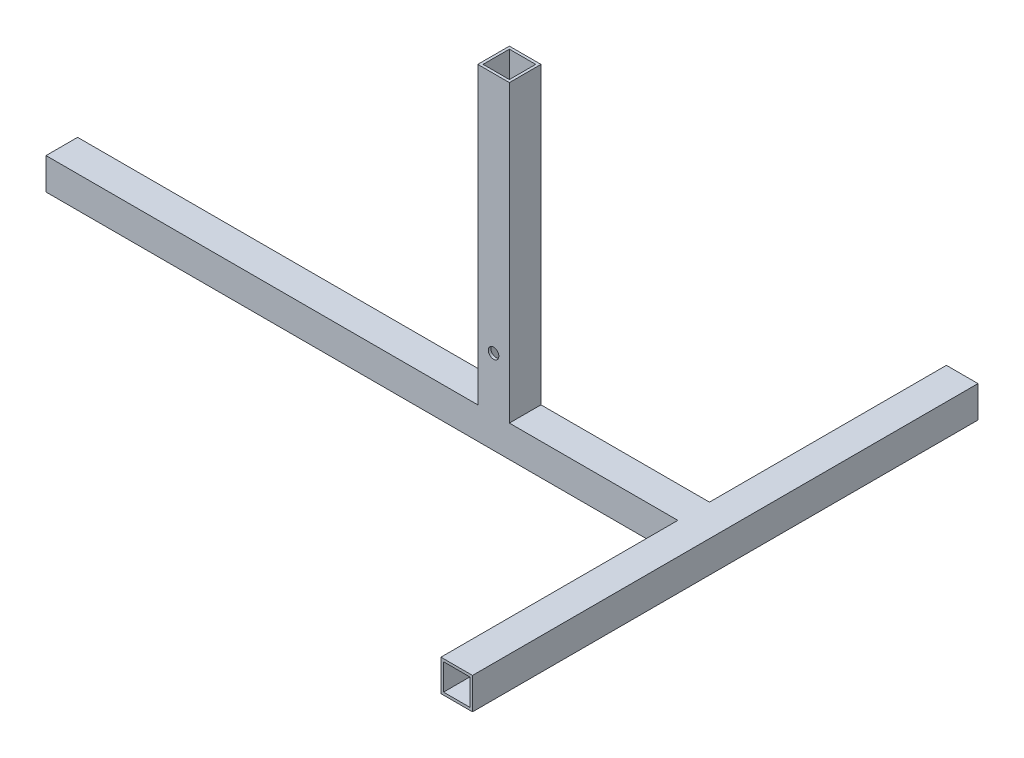
ISO-10303-21;
HEADER;
FILE_DESCRIPTION(('STEP AP214'),'2;1');
FILE_NAME('part.step','',(''),(''),'','','');
FILE_SCHEMA(('AUTOMOTIVE_DESIGN { 1 0 10303 214 1 1 1 1 }'));
ENDSEC;
DATA;
#1=APPLICATION_CONTEXT('core data for automotive mechanical design processes');
#2=APPLICATION_PROTOCOL_DEFINITION('international standard','automotive_design',2000,#1);
#3=PRODUCT_CONTEXT('',#1,'mechanical');
#4=PRODUCT('Part','Part','',(#3));
#5=PRODUCT_RELATED_PRODUCT_CATEGORY('part','',(#4));
#6=PRODUCT_DEFINITION_FORMATION('','',#4);
#7=PRODUCT_DEFINITION_CONTEXT('part definition',#1,'design');
#8=PRODUCT_DEFINITION('design','',#6,#7);
#9=PRODUCT_DEFINITION_SHAPE('','',#8);
#10=(LENGTH_UNIT() NAMED_UNIT(*) SI_UNIT(.MILLI.,.METRE.));
#11=(NAMED_UNIT(*) PLANE_ANGLE_UNIT() SI_UNIT($,.RADIAN.));
#12=(NAMED_UNIT(*) SI_UNIT($,.STERADIAN.) SOLID_ANGLE_UNIT());
#13=UNCERTAINTY_MEASURE_WITH_UNIT(LENGTH_MEASURE(1.E-05),#10,'distance_accuracy_value','');
#14=(GEOMETRIC_REPRESENTATION_CONTEXT(3) GLOBAL_UNCERTAINTY_ASSIGNED_CONTEXT((#13)) GLOBAL_UNIT_ASSIGNED_CONTEXT((#10,
#11,#12)) REPRESENTATION_CONTEXT('',''));
#15=CARTESIAN_POINT('',(0.,0.,0.));
#16=DIRECTION('',(0.,0.,1.));
#17=DIRECTION('',(1.,0.,0.));
#18=AXIS2_PLACEMENT_3D('',#15,#16,#17);
#19=CARTESIAN_POINT('',(-539.75,38.1,19.05));
#20=DIRECTION('',(0.,1.,0.));
#21=DIRECTION('',(0.,0.,1.));
#22=AXIS2_PLACEMENT_3D('',#19,#20,#21);
#23=PLANE('',#22);
#24=DIRECTION('',(0.,0.,-1.));
#25=VECTOR('',#24,1.);
#26=CARTESIAN_POINT('',(19.05,38.1,-19.05));
#27=LINE('',#26,#25);
#28=CARTESIAN_POINT('',(19.05,38.1,19.05));
#29=VERTEX_POINT('',#28);
#30=CARTESIAN_POINT('',(19.05,38.1,-19.05));
#31=VERTEX_POINT('',#30);
#32=EDGE_CURVE('E312',#29,#31,#27,.T.);
#33=ORIENTED_EDGE('',*,*,#32,.F.);
#34=DIRECTION('',(1.,0.,0.));
#35=VECTOR('',#34,1.);
#36=CARTESIAN_POINT('',(-539.75,38.1,19.05));
#37=LINE('',#36,#35);
#38=CARTESIAN_POINT('',(222.25,38.1,19.05));
#39=VERTEX_POINT('',#38);
#40=EDGE_CURVE('E52',#29,#39,#37,.T.);
#41=ORIENTED_EDGE('',*,*,#40,.T.);
#42=DIRECTION('',(0.,0.,-1.));
#43=VECTOR('',#42,1.);
#44=CARTESIAN_POINT('',(222.25,38.1,304.8));
#45=LINE('',#44,#43);
#46=CARTESIAN_POINT('',(222.25,38.1,304.8));
#47=VERTEX_POINT('',#46);
#48=EDGE_CURVE('E270',#47,#39,#45,.T.);
#49=ORIENTED_EDGE('',*,*,#48,.F.);
#50=DIRECTION('',(-1.,0.,0.));
#51=VECTOR('',#50,1.);
#52=CARTESIAN_POINT('',(222.25,38.1,304.8));
#53=LINE('',#52,#51);
#54=CARTESIAN_POINT('',(260.35,38.1,304.8));
#55=VERTEX_POINT('',#54);
#56=EDGE_CURVE('E259',#55,#47,#53,.T.);
#57=ORIENTED_EDGE('',*,*,#56,.F.);
#58=DIRECTION('',(0.,0.,-1.));
#59=VECTOR('',#58,1.);
#60=CARTESIAN_POINT('',(260.35,38.1,304.8));
#61=LINE('',#60,#59);
#62=CARTESIAN_POINT('',(260.35,38.1,-304.8));
#63=VERTEX_POINT('',#62);
#64=EDGE_CURVE('E273',#55,#63,#61,.T.);
#65=ORIENTED_EDGE('',*,*,#64,.T.);
#66=DIRECTION('',(-1.,0.,0.));
#67=VECTOR('',#66,1.);
#68=CARTESIAN_POINT('',(222.25,38.1,-304.8));
#69=LINE('',#68,#67);
#70=CARTESIAN_POINT('',(222.25,38.1,-304.8));
#71=VERTEX_POINT('',#70);
#72=EDGE_CURVE('E255',#63,#71,#69,.T.);
#73=ORIENTED_EDGE('',*,*,#72,.T.);
#74=CARTESIAN_POINT('',(222.25,38.1,-19.0499999999999));
#75=VERTEX_POINT('',#74);
#76=EDGE_CURVE('E261',#75,#71,#45,.T.);
#77=ORIENTED_EDGE('',*,*,#76,.F.);
#78=DIRECTION('',(1.,0.,0.));
#79=VECTOR('',#78,1.);
#80=CARTESIAN_POINT('',(-539.75,38.1,-19.05));
#81=LINE('',#80,#79);
#82=EDGE_CURVE('E68',#31,#75,#81,.T.);
#83=ORIENTED_EDGE('',*,*,#82,.F.);
#84=EDGE_LOOP('',(#33,#41,#49,#57,#65,#73,#77,#83));
#85=FACE_BOUND('',#84,.T.);
#86=ADVANCED_FACE('F43',(#85),#23,.T.);
#87=CARTESIAN_POINT('',(-539.75,0.,19.05));
#88=DIRECTION('',(0.,0.,1.));
#89=DIRECTION('',(1.,0.,0.));
#90=AXIS2_PLACEMENT_3D('',#87,#88,#89);
#91=PLANE('',#90);
#92=CARTESIAN_POINT('',(0.,101.6,19.05));
#93=DIRECTION('',(0.,0.,1.));
#94=DIRECTION('',(1.,0.,0.));
#95=AXIS2_PLACEMENT_3D('',#92,#93,#94);
#96=CIRCLE('',#95,6.35);
#97=CARTESIAN_POINT('',(6.35,101.6,19.05));
#98=VERTEX_POINT('',#97);
#99=EDGE_CURVE('E489',#98,#98,#96,.T.);
#100=ORIENTED_EDGE('',*,*,#99,.F.);
#101=EDGE_LOOP('',(#100));
#102=FACE_BOUND('',#101,.T.);
#103=DIRECTION('',(1.,0.,0.));
#104=VECTOR('',#103,1.);
#105=CARTESIAN_POINT('',(-539.75,0.,19.05));
#106=LINE('',#105,#104);
#107=CARTESIAN_POINT('',(-539.75,0.,19.05));
#108=VERTEX_POINT('',#107);
#109=CARTESIAN_POINT('',(222.25,0.,19.05));
#110=VERTEX_POINT('',#109);
#111=EDGE_CURVE('E394',#108,#110,#106,.T.);
#112=ORIENTED_EDGE('',*,*,#111,.T.);
#113=DIRECTION('',(0.,-1.,0.));
#114=VECTOR('',#113,1.);
#115=CARTESIAN_POINT('',(222.25,0.,19.05));
#116=LINE('',#115,#114);
#117=EDGE_CURVE('E352',#39,#110,#116,.T.);
#118=ORIENTED_EDGE('',*,*,#117,.F.);
#119=ORIENTED_EDGE('',*,*,#40,.F.);
#120=DIRECTION('',(0.,-1.,0.));
#121=VECTOR('',#120,1.);
#122=CARTESIAN_POINT('',(19.05,393.7,19.0500000000001));
#123=LINE('',#122,#121);
#124=CARTESIAN_POINT('',(19.05,393.7,19.0500000000001));
#125=VERTEX_POINT('',#124);
#126=EDGE_CURVE('E323',#125,#29,#123,.T.);
#127=ORIENTED_EDGE('',*,*,#126,.F.);
#128=DIRECTION('',(1.,0.,0.));
#129=VECTOR('',#128,1.);
#130=CARTESIAN_POINT('',(-19.05,393.7,19.0500000000001));
#131=LINE('',#130,#129);
#132=CARTESIAN_POINT('',(-19.05,393.7,19.0500000000001));
#133=VERTEX_POINT('',#132);
#134=EDGE_CURVE('E321',#133,#125,#131,.T.);
#135=ORIENTED_EDGE('',*,*,#134,.F.);
#136=DIRECTION('',(0.,-1.,0.));
#137=VECTOR('',#136,1.);
#138=CARTESIAN_POINT('',(-19.05,393.7,19.0500000000001));
#139=LINE('',#138,#137);
#140=CARTESIAN_POINT('',(-19.05,38.1,19.05));
#141=VERTEX_POINT('',#140);
#142=EDGE_CURVE('E332',#133,#141,#139,.T.);
#143=ORIENTED_EDGE('',*,*,#142,.T.);
#144=CARTESIAN_POINT('',(-539.75,38.1,19.05));
#145=VERTEX_POINT('',#144);
#146=EDGE_CURVE('E12',#145,#141,#37,.T.);
#147=ORIENTED_EDGE('',*,*,#146,.F.);
#148=DIRECTION('',(0.,-1.,0.));
#149=VECTOR('',#148,1.);
#150=CARTESIAN_POINT('',(-539.75,0.,19.05));
#151=LINE('',#150,#149);
#152=EDGE_CURVE('E374',#145,#108,#151,.T.);
#153=ORIENTED_EDGE('',*,*,#152,.T.);
#154=EDGE_LOOP('',(#112,#118,#119,#127,#135,#143,#147,#153));
#155=FACE_BOUND('',#154,.T.);
#156=ADVANCED_FACE('F45',(#102,#155),#91,.T.);
#157=DIRECTION('',(0.,0.,1.));
#158=VECTOR('',#157,1.);
#159=CARTESIAN_POINT('',(-19.05,38.1,-19.05));
#160=LINE('',#159,#158);
#161=CARTESIAN_POINT('',(-19.05,38.1,-19.05));
#162=VERTEX_POINT('',#161);
#163=EDGE_CURVE('E317',#162,#141,#160,.T.);
#164=ORIENTED_EDGE('',*,*,#163,.F.);
#165=CARTESIAN_POINT('',(-539.75,38.1,-19.05));
#166=VERTEX_POINT('',#165);
#167=EDGE_CURVE('E396',#166,#162,#81,.T.);
#168=ORIENTED_EDGE('',*,*,#167,.F.);
#169=DIRECTION('',(0.,0.,1.));
#170=VECTOR('',#169,1.);
#171=CARTESIAN_POINT('',(-539.75,38.1,19.05));
#172=LINE('',#171,#170);
#173=EDGE_CURVE('E392',#166,#145,#172,.T.);
#174=ORIENTED_EDGE('',*,*,#173,.T.);
#175=ORIENTED_EDGE('',*,*,#146,.T.);
#176=EDGE_LOOP('',(#164,#168,#174,#175));
#177=FACE_BOUND('',#176,.T.);
#178=ADVANCED_FACE('F432',(#177),#23,.T.);
#179=CARTESIAN_POINT('',(-539.75,0.,-19.05));
#180=DIRECTION('',(0.,0.,-1.));
#181=DIRECTION('',(-1.,0.,0.));
#182=AXIS2_PLACEMENT_3D('',#179,#180,#181);
#183=PLANE('',#182);
#184=CARTESIAN_POINT('',(0.,101.6,-19.05));
#185=DIRECTION('',(0.,0.,-1.));
#186=DIRECTION('',(-1.,0.,0.));
#187=AXIS2_PLACEMENT_3D('',#184,#185,#186);
#188=CIRCLE('',#187,6.35);
#189=CARTESIAN_POINT('',(-6.35,101.6,-19.05));
#190=VERTEX_POINT('',#189);
#191=EDGE_CURVE('E240',#190,#190,#188,.T.);
#192=ORIENTED_EDGE('',*,*,#191,.F.);
#193=EDGE_LOOP('',(#192));
#194=FACE_BOUND('',#193,.T.);
#195=ORIENTED_EDGE('',*,*,#167,.T.);
#196=DIRECTION('',(0.,-1.,0.));
#197=VECTOR('',#196,1.);
#198=CARTESIAN_POINT('',(-19.05,393.7,-19.0499999999999));
#199=LINE('',#198,#197);
#200=CARTESIAN_POINT('',(-19.05,393.7,-19.0499999999999));
#201=VERTEX_POINT('',#200);
#202=EDGE_CURVE('E335',#201,#162,#199,.T.);
#203=ORIENTED_EDGE('',*,*,#202,.F.);
#204=DIRECTION('',(-1.,0.,0.));
#205=VECTOR('',#204,1.);
#206=CARTESIAN_POINT('',(-19.05,393.7,-19.0499999999999));
#207=LINE('',#206,#205);
#208=CARTESIAN_POINT('',(19.05,393.7,-19.0499999999999));
#209=VERTEX_POINT('',#208);
#210=EDGE_CURVE('E316',#209,#201,#207,.T.);
#211=ORIENTED_EDGE('',*,*,#210,.F.);
#212=DIRECTION('',(0.,-1.,0.));
#213=VECTOR('',#212,1.);
#214=CARTESIAN_POINT('',(19.05,393.7,-19.0499999999999));
#215=LINE('',#214,#213);
#216=EDGE_CURVE('E338',#209,#31,#215,.T.);
#217=ORIENTED_EDGE('',*,*,#216,.T.);
#218=ORIENTED_EDGE('',*,*,#82,.T.);
#219=DIRECTION('',(0.,1.,0.));
#220=VECTOR('',#219,1.);
#221=CARTESIAN_POINT('',(222.25,0.,-19.05));
#222=LINE('',#221,#220);
#223=CARTESIAN_POINT('',(222.25,0.,-19.05));
#224=VERTEX_POINT('',#223);
#225=EDGE_CURVE('E355',#224,#75,#222,.T.);
#226=ORIENTED_EDGE('',*,*,#225,.F.);
#227=DIRECTION('',(1.,0.,0.));
#228=VECTOR('',#227,1.);
#229=CARTESIAN_POINT('',(-539.75,0.,-19.05));
#230=LINE('',#229,#228);
#231=CARTESIAN_POINT('',(-539.75,0.,-19.05));
#232=VERTEX_POINT('',#231);
#233=EDGE_CURVE('E399',#232,#224,#230,.T.);
#234=ORIENTED_EDGE('',*,*,#233,.F.);
#235=DIRECTION('',(0.,1.,0.));
#236=VECTOR('',#235,1.);
#237=CARTESIAN_POINT('',(-539.75,0.,-19.05));
#238=LINE('',#237,#236);
#239=EDGE_CURVE('E389',#232,#166,#238,.T.);
#240=ORIENTED_EDGE('',*,*,#239,.T.);
#241=EDGE_LOOP('',(#195,#203,#211,#217,#218,#226,#234,#240));
#242=FACE_BOUND('',#241,.T.);
#243=ADVANCED_FACE('F434',(#194,#242),#183,.T.);
#244=CARTESIAN_POINT('',(-539.75,0.,19.05));
#245=DIRECTION('',(0.,-1.,0.));
#246=DIRECTION('',(0.,0.,-1.));
#247=AXIS2_PLACEMENT_3D('',#244,#245,#246);
#248=PLANE('',#247);
#249=ORIENTED_EDGE('',*,*,#233,.T.);
#250=DIRECTION('',(0.,0.,-1.));
#251=VECTOR('',#250,1.);
#252=CARTESIAN_POINT('',(222.25,0.,304.8));
#253=LINE('',#252,#251);
#254=CARTESIAN_POINT('',(222.25,0.,-304.8));
#255=VERTEX_POINT('',#254);
#256=EDGE_CURVE('E279',#224,#255,#253,.T.);
#257=ORIENTED_EDGE('',*,*,#256,.T.);
#258=DIRECTION('',(1.,0.,0.));
#259=VECTOR('',#258,1.);
#260=CARTESIAN_POINT('',(222.25,0.,-304.8));
#261=LINE('',#260,#259);
#262=CARTESIAN_POINT('',(260.35,0.,-304.8));
#263=VERTEX_POINT('',#262);
#264=EDGE_CURVE('E264',#255,#263,#261,.T.);
#265=ORIENTED_EDGE('',*,*,#264,.T.);
#266=DIRECTION('',(0.,0.,-1.));
#267=VECTOR('',#266,1.);
#268=CARTESIAN_POINT('',(260.35,0.,304.8));
#269=LINE('',#268,#267);
#270=CARTESIAN_POINT('',(260.35,0.,304.8));
#271=VERTEX_POINT('',#270);
#272=EDGE_CURVE('E276',#271,#263,#269,.T.);
#273=ORIENTED_EDGE('',*,*,#272,.F.);
#274=DIRECTION('',(1.,0.,0.));
#275=VECTOR('',#274,1.);
#276=CARTESIAN_POINT('',(222.25,0.,304.8));
#277=LINE('',#276,#275);
#278=CARTESIAN_POINT('',(222.25,0.,304.8));
#279=VERTEX_POINT('',#278);
#280=EDGE_CURVE('E254',#279,#271,#277,.T.);
#281=ORIENTED_EDGE('',*,*,#280,.F.);
#282=EDGE_CURVE('E280',#279,#110,#253,.T.);
#283=ORIENTED_EDGE('',*,*,#282,.T.);
#284=ORIENTED_EDGE('',*,*,#111,.F.);
#285=DIRECTION('',(0.,0.,-1.));
#286=VECTOR('',#285,1.);
#287=CARTESIAN_POINT('',(-539.75,0.,19.05));
#288=LINE('',#287,#286);
#289=EDGE_CURVE('E386',#108,#232,#288,.T.);
#290=ORIENTED_EDGE('',*,*,#289,.T.);
#291=EDGE_LOOP('',(#249,#257,#265,#273,#281,#283,#284,#290));
#292=FACE_BOUND('',#291,.T.);
#293=ADVANCED_FACE('F411',(#292),#248,.T.);
#294=CARTESIAN_POINT('',(-539.75,0.,0.));
#295=DIRECTION('',(-1.,0.,0.));
#296=DIRECTION('',(0.,0.,1.));
#297=AXIS2_PLACEMENT_3D('',#294,#295,#296);
#298=PLANE('',#297);
#299=DIRECTION('',(0.,-1.,0.));
#300=VECTOR('',#299,1.);
#301=CARTESIAN_POINT('',(-539.75,3.175,15.875));
#302=LINE('',#301,#300);
#303=CARTESIAN_POINT('',(-539.75,34.925,15.875));
#304=VERTEX_POINT('',#303);
#305=CARTESIAN_POINT('',(-539.75,3.175,15.875));
#306=VERTEX_POINT('',#305);
#307=EDGE_CURVE('E358',#304,#306,#302,.T.);
#308=ORIENTED_EDGE('',*,*,#307,.T.);
#309=DIRECTION('',(0.,0.,-1.));
#310=VECTOR('',#309,1.);
#311=CARTESIAN_POINT('',(-539.75,3.175,15.875));
#312=LINE('',#311,#310);
#313=CARTESIAN_POINT('',(-539.75,3.175,-15.875));
#314=VERTEX_POINT('',#313);
#315=EDGE_CURVE('E361',#306,#314,#312,.T.);
#316=ORIENTED_EDGE('',*,*,#315,.T.);
#317=DIRECTION('',(0.,1.,0.));
#318=VECTOR('',#317,1.);
#319=CARTESIAN_POINT('',(-539.75,3.175,-15.875));
#320=LINE('',#319,#318);
#321=CARTESIAN_POINT('',(-539.75,34.925,-15.875));
#322=VERTEX_POINT('',#321);
#323=EDGE_CURVE('E364',#314,#322,#320,.T.);
#324=ORIENTED_EDGE('',*,*,#323,.T.);
#325=DIRECTION('',(0.,0.,1.));
#326=VECTOR('',#325,1.);
#327=CARTESIAN_POINT('',(-539.75,34.925,15.875));
#328=LINE('',#327,#326);
#329=EDGE_CURVE('E367',#322,#304,#328,.T.);
#330=ORIENTED_EDGE('',*,*,#329,.T.);
#331=EDGE_LOOP('',(#308,#316,#324,#330));
#332=FACE_BOUND('',#331,.T.);
#333=ORIENTED_EDGE('',*,*,#152,.F.);
#334=ORIENTED_EDGE('',*,*,#173,.F.);
#335=ORIENTED_EDGE('',*,*,#239,.F.);
#336=ORIENTED_EDGE('',*,*,#289,.F.);
#337=EDGE_LOOP('',(#333,#334,#335,#336));
#338=FACE_BOUND('',#337,.T.);
#339=ADVANCED_FACE('F439',(#332,#338),#298,.T.);
#340=CARTESIAN_POINT('',(-539.75,3.175,15.875));
#341=DIRECTION('',(0.,0.,1.));
#342=DIRECTION('',(1.,0.,0.));
#343=AXIS2_PLACEMENT_3D('',#340,#341,#342);
#344=PLANE('',#343);
#345=DIRECTION('',(1.,0.,0.));
#346=VECTOR('',#345,1.);
#347=CARTESIAN_POINT('',(-539.75,34.925,15.875));
#348=LINE('',#347,#346);
#349=CARTESIAN_POINT('',(222.25,34.925,15.875));
#350=VERTEX_POINT('',#349);
#351=EDGE_CURVE('E371',#304,#350,#348,.T.);
#352=ORIENTED_EDGE('',*,*,#351,.T.);
#353=DIRECTION('',(0.,-1.,0.));
#354=VECTOR('',#353,1.);
#355=CARTESIAN_POINT('',(222.25,3.175,15.875));
#356=LINE('',#355,#354);
#357=CARTESIAN_POINT('',(222.25,3.175,15.875));
#358=VERTEX_POINT('',#357);
#359=EDGE_CURVE('E340',#350,#358,#356,.T.);
#360=ORIENTED_EDGE('',*,*,#359,.T.);
#361=DIRECTION('',(1.,0.,0.));
#362=VECTOR('',#361,1.);
#363=CARTESIAN_POINT('',(-539.75,3.175,15.875));
#364=LINE('',#363,#362);
#365=EDGE_CURVE('E370',#306,#358,#364,.T.);
#366=ORIENTED_EDGE('',*,*,#365,.F.);
#367=ORIENTED_EDGE('',*,*,#307,.F.);
#368=EDGE_LOOP('',(#352,#360,#366,#367));
#369=FACE_BOUND('',#368,.T.);
#370=ADVANCED_FACE('F534',(#369),#344,.F.);
#371=CARTESIAN_POINT('',(-539.75,34.925,15.875));
#372=DIRECTION('',(0.,1.,0.));
#373=DIRECTION('',(0.,0.,1.));
#374=AXIS2_PLACEMENT_3D('',#371,#372,#373);
#375=PLANE('',#374);
#376=DIRECTION('',(1.,0.,0.));
#377=VECTOR('',#376,1.);
#378=CARTESIAN_POINT('',(-539.75,34.925,-15.875));
#379=LINE('',#378,#377);
#380=CARTESIAN_POINT('',(222.25,34.925,-15.875));
#381=VERTEX_POINT('',#380);
#382=EDGE_CURVE('E375',#322,#381,#379,.T.);
#383=ORIENTED_EDGE('',*,*,#382,.T.);
#384=DIRECTION('',(0.,0.,1.));
#385=VECTOR('',#384,1.);
#386=CARTESIAN_POINT('',(222.25,34.925,15.875));
#387=LINE('',#386,#385);
#388=EDGE_CURVE('E349',#381,#350,#387,.T.);
#389=ORIENTED_EDGE('',*,*,#388,.T.);
#390=ORIENTED_EDGE('',*,*,#351,.F.);
#391=ORIENTED_EDGE('',*,*,#329,.F.);
#392=EDGE_LOOP('',(#383,#389,#390,#391));
#393=FACE_BOUND('',#392,.T.);
#394=ADVANCED_FACE('F530',(#393),#375,.F.);
#395=CARTESIAN_POINT('',(-539.75,3.175,-15.875));
#396=DIRECTION('',(0.,0.,-1.));
#397=DIRECTION('',(-1.,0.,0.));
#398=AXIS2_PLACEMENT_3D('',#395,#396,#397);
#399=PLANE('',#398);
#400=DIRECTION('',(1.,0.,0.));
#401=VECTOR('',#400,1.);
#402=CARTESIAN_POINT('',(-539.75,3.175,-15.875));
#403=LINE('',#402,#401);
#404=CARTESIAN_POINT('',(222.25,3.175,-15.875));
#405=VERTEX_POINT('',#404);
#406=EDGE_CURVE('E378',#314,#405,#403,.T.);
#407=ORIENTED_EDGE('',*,*,#406,.T.);
#408=DIRECTION('',(0.,1.,0.));
#409=VECTOR('',#408,1.);
#410=CARTESIAN_POINT('',(222.25,3.175,-15.875));
#411=LINE('',#410,#409);
#412=EDGE_CURVE('E346',#405,#381,#411,.T.);
#413=ORIENTED_EDGE('',*,*,#412,.T.);
#414=ORIENTED_EDGE('',*,*,#382,.F.);
#415=ORIENTED_EDGE('',*,*,#323,.F.);
#416=EDGE_LOOP('',(#407,#413,#414,#415));
#417=FACE_BOUND('',#416,.T.);
#418=ADVANCED_FACE('F533',(#417),#399,.F.);
#419=CARTESIAN_POINT('',(-539.75,3.175,15.875));
#420=DIRECTION('',(0.,-1.,0.));
#421=DIRECTION('',(0.,0.,-1.));
#422=AXIS2_PLACEMENT_3D('',#419,#420,#421);
#423=PLANE('',#422);
#424=ORIENTED_EDGE('',*,*,#365,.T.);
#425=DIRECTION('',(0.,0.,-1.));
#426=VECTOR('',#425,1.);
#427=CARTESIAN_POINT('',(222.25,3.175,15.875));
#428=LINE('',#427,#426);
#429=EDGE_CURVE('E343',#358,#405,#428,.T.);
#430=ORIENTED_EDGE('',*,*,#429,.T.);
#431=ORIENTED_EDGE('',*,*,#406,.F.);
#432=ORIENTED_EDGE('',*,*,#315,.F.);
#433=EDGE_LOOP('',(#424,#430,#431,#432));
#434=FACE_BOUND('',#433,.T.);
#435=ADVANCED_FACE('F525',(#434),#423,.F.);
#436=CARTESIAN_POINT('',(0.,393.7,0.));
#437=DIRECTION('',(0.,1.,0.));
#438=DIRECTION('',(0.,0.,1.));
#439=AXIS2_PLACEMENT_3D('',#436,#437,#438);
#440=PLANE('',#439);
#441=DIRECTION('',(0.,0.,-1.));
#442=VECTOR('',#441,1.);
#443=CARTESIAN_POINT('',(19.05,393.7,-19.0499999999999));
#444=LINE('',#443,#442);
#445=EDGE_CURVE('E313',#125,#209,#444,.T.);
#446=ORIENTED_EDGE('',*,*,#445,.T.);
#447=ORIENTED_EDGE('',*,*,#210,.T.);
#448=DIRECTION('',(0.,0.,1.));
#449=VECTOR('',#448,1.);
#450=CARTESIAN_POINT('',(-19.05,393.7,-19.0499999999999));
#451=LINE('',#450,#449);
#452=EDGE_CURVE('E319',#201,#133,#451,.T.);
#453=ORIENTED_EDGE('',*,*,#452,.T.);
#454=ORIENTED_EDGE('',*,*,#134,.T.);
#455=EDGE_LOOP('',(#446,#447,#453,#454));
#456=FACE_BOUND('',#455,.T.);
#457=DIRECTION('',(0.,0.,1.));
#458=VECTOR('',#457,1.);
#459=CARTESIAN_POINT('',(-15.875,393.7,-15.8749999999999));
#460=LINE('',#459,#458);
#461=CARTESIAN_POINT('',(-15.875,393.7,-15.8749999999999));
#462=VERTEX_POINT('',#461);
#463=CARTESIAN_POINT('',(-15.875,393.7,15.8750000000001));
#464=VERTEX_POINT('',#463);
#465=EDGE_CURVE('E286',#462,#464,#460,.T.);
#466=ORIENTED_EDGE('',*,*,#465,.F.);
#467=DIRECTION('',(-1.,0.,0.));
#468=VECTOR('',#467,1.);
#469=CARTESIAN_POINT('',(-15.875,393.7,-15.8749999999999));
#470=LINE('',#469,#468);
#471=CARTESIAN_POINT('',(15.875,393.7,-15.8749999999999));
#472=VERTEX_POINT('',#471);
#473=EDGE_CURVE('E284',#472,#462,#470,.T.);
#474=ORIENTED_EDGE('',*,*,#473,.F.);
#475=DIRECTION('',(0.,0.,-1.));
#476=VECTOR('',#475,1.);
#477=CARTESIAN_POINT('',(15.875,393.7,-15.8749999999999));
#478=LINE('',#477,#476);
#479=CARTESIAN_POINT('',(15.875,393.7,15.8750000000001));
#480=VERTEX_POINT('',#479);
#481=EDGE_CURVE('E292',#480,#472,#478,.T.);
#482=ORIENTED_EDGE('',*,*,#481,.F.);
#483=DIRECTION('',(1.,0.,0.));
#484=VECTOR('',#483,1.);
#485=CARTESIAN_POINT('',(-15.875,393.7,15.8750000000001));
#486=LINE('',#485,#484);
#487=EDGE_CURVE('E289',#464,#480,#486,.T.);
#488=ORIENTED_EDGE('',*,*,#487,.F.);
#489=EDGE_LOOP('',(#466,#474,#482,#488));
#490=FACE_BOUND('',#489,.T.);
#491=ADVANCED_FACE('F424',(#456,#490),#440,.T.);
#492=CARTESIAN_POINT('',(19.05,393.7,-19.0499999999999));
#493=DIRECTION('',(-1.,0.,0.));
#494=DIRECTION('',(0.,0.,1.));
#495=AXIS2_PLACEMENT_3D('',#492,#493,#494);
#496=PLANE('',#495);
#497=ORIENTED_EDGE('',*,*,#32,.T.);
#498=ORIENTED_EDGE('',*,*,#216,.F.);
#499=ORIENTED_EDGE('',*,*,#445,.F.);
#500=ORIENTED_EDGE('',*,*,#126,.T.);
#501=EDGE_LOOP('',(#497,#498,#499,#500));
#502=FACE_BOUND('',#501,.T.);
#503=ADVANCED_FACE('F421',(#502),#496,.F.);
#504=CARTESIAN_POINT('',(-19.05,393.7,-19.0499999999999));
#505=DIRECTION('',(1.,0.,0.));
#506=DIRECTION('',(0.,0.,-1.));
#507=AXIS2_PLACEMENT_3D('',#504,#505,#506);
#508=PLANE('',#507);
#509=ORIENTED_EDGE('',*,*,#163,.T.);
#510=ORIENTED_EDGE('',*,*,#142,.F.);
#511=ORIENTED_EDGE('',*,*,#452,.F.);
#512=ORIENTED_EDGE('',*,*,#202,.T.);
#513=EDGE_LOOP('',(#509,#510,#511,#512));
#514=FACE_BOUND('',#513,.T.);
#515=ADVANCED_FACE('F430',(#514),#508,.F.);
#516=CARTESIAN_POINT('',(-15.875,393.7,-15.8749999999999));
#517=DIRECTION('',(0.,0.,1.));
#518=DIRECTION('',(0.,-1.,0.));
#519=AXIS2_PLACEMENT_3D('',#516,#517,#518);
#520=PLANE('',#519);
#521=CARTESIAN_POINT('',(0.,101.6,-15.875));
#522=DIRECTION('',(0.,0.,1.));
#523=DIRECTION('',(0.,-1.,0.));
#524=AXIS2_PLACEMENT_3D('',#521,#522,#523);
#525=CIRCLE('',#524,6.35);
#526=CARTESIAN_POINT('',(0.,95.25,-15.875));
#527=VERTEX_POINT('',#526);
#528=EDGE_CURVE('E485',#527,#527,#525,.T.);
#529=ORIENTED_EDGE('',*,*,#528,.F.);
#530=EDGE_LOOP('',(#529));
#531=FACE_BOUND('',#530,.T.);
#532=DIRECTION('',(-1.,0.,0.));
#533=VECTOR('',#532,1.);
#534=CARTESIAN_POINT('',(-15.875,38.1,-15.875));
#535=LINE('',#534,#533);
#536=CARTESIAN_POINT('',(15.875,38.1,-15.875));
#537=VERTEX_POINT('',#536);
#538=CARTESIAN_POINT('',(-15.875,38.1,-15.875));
#539=VERTEX_POINT('',#538);
#540=EDGE_CURVE('E283',#537,#539,#535,.T.);
#541=ORIENTED_EDGE('',*,*,#540,.F.);
#542=DIRECTION('',(0.,-1.,0.));
#543=VECTOR('',#542,1.);
#544=CARTESIAN_POINT('',(15.875,393.7,-15.8749999999999));
#545=LINE('',#544,#543);
#546=EDGE_CURVE('E60',#472,#537,#545,.T.);
#547=ORIENTED_EDGE('',*,*,#546,.F.);
#548=ORIENTED_EDGE('',*,*,#473,.T.);
#549=DIRECTION('',(0.,-1.,0.));
#550=VECTOR('',#549,1.);
#551=CARTESIAN_POINT('',(-15.875,393.7,-15.8749999999999));
#552=LINE('',#551,#550);
#553=EDGE_CURVE('E309',#462,#539,#552,.T.);
#554=ORIENTED_EDGE('',*,*,#553,.T.);
#555=EDGE_LOOP('',(#541,#547,#548,#554));
#556=FACE_BOUND('',#555,.T.);
#557=ADVANCED_FACE('F510',(#531,#556),#520,.T.);
#558=CARTESIAN_POINT('',(-15.875,393.7,-15.8749999999999));
#559=DIRECTION('',(1.,0.,0.));
#560=DIRECTION('',(0.,0.,-1.));
#561=AXIS2_PLACEMENT_3D('',#558,#559,#560);
#562=PLANE('',#561);
#563=DIRECTION('',(0.,0.,1.));
#564=VECTOR('',#563,1.);
#565=CARTESIAN_POINT('',(-15.875,38.1,-15.875));
#566=LINE('',#565,#564);
#567=CARTESIAN_POINT('',(-15.875,38.1,15.875));
#568=VERTEX_POINT('',#567);
#569=EDGE_CURVE('E296',#539,#568,#566,.T.);
#570=ORIENTED_EDGE('',*,*,#569,.F.);
#571=ORIENTED_EDGE('',*,*,#553,.F.);
#572=ORIENTED_EDGE('',*,*,#465,.T.);
#573=DIRECTION('',(0.,-1.,0.));
#574=VECTOR('',#573,1.);
#575=CARTESIAN_POINT('',(-15.875,393.7,15.8750000000001));
#576=LINE('',#575,#574);
#577=EDGE_CURVE('E307',#464,#568,#576,.T.);
#578=ORIENTED_EDGE('',*,*,#577,.T.);
#579=EDGE_LOOP('',(#570,#571,#572,#578));
#580=FACE_BOUND('',#579,.T.);
#581=ADVANCED_FACE('F501',(#580),#562,.T.);
#582=CARTESIAN_POINT('',(-15.875,393.7,15.8750000000001));
#583=DIRECTION('',(0.,0.,-1.));
#584=DIRECTION('',(0.,1.,0.));
#585=AXIS2_PLACEMENT_3D('',#582,#583,#584);
#586=PLANE('',#585);
#587=CARTESIAN_POINT('',(0.,101.6,15.875));
#588=DIRECTION('',(0.,0.,-1.));
#589=DIRECTION('',(0.,1.,0.));
#590=AXIS2_PLACEMENT_3D('',#587,#588,#589);
#591=CIRCLE('',#590,6.35);
#592=CARTESIAN_POINT('',(0.,107.95,15.875));
#593=VERTEX_POINT('',#592);
#594=EDGE_CURVE('E47',#593,#593,#591,.T.);
#595=ORIENTED_EDGE('',*,*,#594,.F.);
#596=EDGE_LOOP('',(#595));
#597=FACE_BOUND('',#596,.T.);
#598=DIRECTION('',(1.,0.,0.));
#599=VECTOR('',#598,1.);
#600=CARTESIAN_POINT('',(-15.875,38.1,15.875));
#601=LINE('',#600,#599);
#602=CARTESIAN_POINT('',(15.875,38.1,15.875));
#603=VERTEX_POINT('',#602);
#604=EDGE_CURVE('E299',#568,#603,#601,.T.);
#605=ORIENTED_EDGE('',*,*,#604,.F.);
#606=ORIENTED_EDGE('',*,*,#577,.F.);
#607=ORIENTED_EDGE('',*,*,#487,.T.);
#608=DIRECTION('',(0.,-1.,0.));
#609=VECTOR('',#608,1.);
#610=CARTESIAN_POINT('',(15.875,393.7,15.8750000000001));
#611=LINE('',#610,#609);
#612=EDGE_CURVE('E305',#480,#603,#611,.T.);
#613=ORIENTED_EDGE('',*,*,#612,.T.);
#614=EDGE_LOOP('',(#605,#606,#607,#613));
#615=FACE_BOUND('',#614,.T.);
#616=ADVANCED_FACE('F498',(#597,#615),#586,.T.);
#617=CARTESIAN_POINT('',(15.875,393.7,-15.8749999999999));
#618=DIRECTION('',(-1.,0.,0.));
#619=DIRECTION('',(0.,0.,1.));
#620=AXIS2_PLACEMENT_3D('',#617,#618,#619);
#621=PLANE('',#620);
#622=DIRECTION('',(0.,0.,-1.));
#623=VECTOR('',#622,1.);
#624=CARTESIAN_POINT('',(15.875,38.1,-15.875));
#625=LINE('',#624,#623);
#626=EDGE_CURVE('E287',#603,#537,#625,.T.);
#627=ORIENTED_EDGE('',*,*,#626,.F.);
#628=ORIENTED_EDGE('',*,*,#612,.F.);
#629=ORIENTED_EDGE('',*,*,#481,.T.);
#630=ORIENTED_EDGE('',*,*,#546,.T.);
#631=EDGE_LOOP('',(#627,#628,#629,#630));
#632=FACE_BOUND('',#631,.T.);
#633=ADVANCED_FACE('F472',(#632),#621,.T.);
#634=ORIENTED_EDGE('',*,*,#626,.T.);
#635=ORIENTED_EDGE('',*,*,#540,.T.);
#636=ORIENTED_EDGE('',*,*,#569,.T.);
#637=ORIENTED_EDGE('',*,*,#604,.T.);
#638=EDGE_LOOP('',(#634,#635,#636,#637));
#639=FACE_BOUND('',#638,.T.);
#640=ADVANCED_FACE('F463',(#639),#23,.T.);
#641=CARTESIAN_POINT('',(222.25,0.,304.8));
#642=DIRECTION('',(1.,0.,0.));
#643=DIRECTION('',(0.,0.,-1.));
#644=AXIS2_PLACEMENT_3D('',#641,#642,#643);
#645=PLANE('',#644);
#646=ORIENTED_EDGE('',*,*,#359,.F.);
#647=ORIENTED_EDGE('',*,*,#388,.F.);
#648=ORIENTED_EDGE('',*,*,#412,.F.);
#649=ORIENTED_EDGE('',*,*,#429,.F.);
#650=EDGE_LOOP('',(#646,#647,#648,#649));
#651=FACE_BOUND('',#650,.T.);
#652=ADVANCED_FACE('F471',(#651),#645,.F.);
#653=ORIENTED_EDGE('',*,*,#48,.T.);
#654=ORIENTED_EDGE('',*,*,#117,.T.);
#655=ORIENTED_EDGE('',*,*,#282,.F.);
#656=DIRECTION('',(0.,-1.,0.));
#657=VECTOR('',#656,1.);
#658=CARTESIAN_POINT('',(222.25,0.,304.8));
#659=LINE('',#658,#657);
#660=EDGE_CURVE('E251',#47,#279,#659,.T.);
#661=ORIENTED_EDGE('',*,*,#660,.F.);
#662=EDGE_LOOP('',(#653,#654,#655,#661));
#663=FACE_BOUND('',#662,.T.);
#664=ADVANCED_FACE('F408',(#663),#645,.F.);
#665=ORIENTED_EDGE('',*,*,#256,.F.);
#666=ORIENTED_EDGE('',*,*,#225,.T.);
#667=ORIENTED_EDGE('',*,*,#76,.T.);
#668=DIRECTION('',(0.,-1.,0.));
#669=VECTOR('',#668,1.);
#670=CARTESIAN_POINT('',(222.25,0.,-304.8));
#671=LINE('',#670,#669);
#672=EDGE_CURVE('E225',#71,#255,#671,.T.);
#673=ORIENTED_EDGE('',*,*,#672,.T.);
#674=EDGE_LOOP('',(#665,#666,#667,#673));
#675=FACE_BOUND('',#674,.T.);
#676=ADVANCED_FACE('F443',(#675),#645,.F.);
#677=CARTESIAN_POINT('',(0.,0.,304.8));
#678=DIRECTION('',(0.,0.,-1.));
#679=DIRECTION('',(-1.,0.,0.));
#680=AXIS2_PLACEMENT_3D('',#677,#678,#679);
#681=PLANE('',#680);
#682=ORIENTED_EDGE('',*,*,#660,.T.);
#683=ORIENTED_EDGE('',*,*,#280,.T.);
#684=DIRECTION('',(0.,1.,0.));
#685=VECTOR('',#684,1.);
#686=CARTESIAN_POINT('',(260.35,0.,304.8));
#687=LINE('',#686,#685);
#688=EDGE_CURVE('E257',#271,#55,#687,.T.);
#689=ORIENTED_EDGE('',*,*,#688,.T.);
#690=ORIENTED_EDGE('',*,*,#56,.T.);
#691=EDGE_LOOP('',(#682,#683,#689,#690));
#692=FACE_BOUND('',#691,.T.);
#693=DIRECTION('',(0.,-1.,0.));
#694=VECTOR('',#693,1.);
#695=CARTESIAN_POINT('',(225.425,3.175,304.8));
#696=LINE('',#695,#694);
#697=CARTESIAN_POINT('',(225.425,34.925,304.8));
#698=VERTEX_POINT('',#697);
#699=CARTESIAN_POINT('',(225.425,3.175,304.8));
#700=VERTEX_POINT('',#699);
#701=EDGE_CURVE('E207',#698,#700,#696,.T.);
#702=ORIENTED_EDGE('',*,*,#701,.F.);
#703=DIRECTION('',(-1.,0.,0.));
#704=VECTOR('',#703,1.);
#705=CARTESIAN_POINT('',(225.425,34.925,304.8));
#706=LINE('',#705,#704);
#707=CARTESIAN_POINT('',(257.175,34.925,304.8));
#708=VERTEX_POINT('',#707);
#709=EDGE_CURVE('E233',#708,#698,#706,.T.);
#710=ORIENTED_EDGE('',*,*,#709,.F.);
#711=DIRECTION('',(0.,1.,0.));
#712=VECTOR('',#711,1.);
#713=CARTESIAN_POINT('',(257.175,3.175,304.8));
#714=LINE('',#713,#712);
#715=CARTESIAN_POINT('',(257.175,3.175,304.8));
#716=VERTEX_POINT('',#715);
#717=EDGE_CURVE('E231',#716,#708,#714,.T.);
#718=ORIENTED_EDGE('',*,*,#717,.F.);
#719=DIRECTION('',(1.,0.,0.));
#720=VECTOR('',#719,1.);
#721=CARTESIAN_POINT('',(225.425,3.175,304.8));
#722=LINE('',#721,#720);
#723=EDGE_CURVE('E217',#700,#716,#722,.T.);
#724=ORIENTED_EDGE('',*,*,#723,.F.);
#725=EDGE_LOOP('',(#702,#710,#718,#724));
#726=FACE_BOUND('',#725,.T.);
#727=ADVANCED_FACE('F229',(#692,#726),#681,.F.);
#728=CARTESIAN_POINT('',(0.,0.,-304.8));
#729=DIRECTION('',(0.,0.,-1.));
#730=DIRECTION('',(-1.,0.,0.));
#731=AXIS2_PLACEMENT_3D('',#728,#729,#730);
#732=PLANE('',#731);
#733=ORIENTED_EDGE('',*,*,#672,.F.);
#734=ORIENTED_EDGE('',*,*,#72,.F.);
#735=DIRECTION('',(0.,1.,0.));
#736=VECTOR('',#735,1.);
#737=CARTESIAN_POINT('',(260.35,0.,-304.8));
#738=LINE('',#737,#736);
#739=EDGE_CURVE('E266',#263,#63,#738,.T.);
#740=ORIENTED_EDGE('',*,*,#739,.F.);
#741=ORIENTED_EDGE('',*,*,#264,.F.);
#742=EDGE_LOOP('',(#733,#734,#740,#741));
#743=FACE_BOUND('',#742,.T.);
#744=DIRECTION('',(-1.,0.,0.));
#745=VECTOR('',#744,1.);
#746=CARTESIAN_POINT('',(225.425,34.925,-304.8));
#747=LINE('',#746,#745);
#748=CARTESIAN_POINT('',(257.175,34.925,-304.8));
#749=VERTEX_POINT('',#748);
#750=CARTESIAN_POINT('',(225.425,34.925,-304.8));
#751=VERTEX_POINT('',#750);
#752=EDGE_CURVE('E218',#749,#751,#747,.T.);
#753=ORIENTED_EDGE('',*,*,#752,.T.);
#754=DIRECTION('',(0.,-1.,0.));
#755=VECTOR('',#754,1.);
#756=CARTESIAN_POINT('',(225.425,3.175,-304.8));
#757=LINE('',#756,#755);
#758=CARTESIAN_POINT('',(225.425,3.175,-304.8));
#759=VERTEX_POINT('',#758);
#760=EDGE_CURVE('E238',#751,#759,#757,.T.);
#761=ORIENTED_EDGE('',*,*,#760,.T.);
#762=DIRECTION('',(1.,0.,0.));
#763=VECTOR('',#762,1.);
#764=CARTESIAN_POINT('',(225.425,3.175,-304.8));
#765=LINE('',#764,#763);
#766=CARTESIAN_POINT('',(257.175,3.175,-304.8));
#767=VERTEX_POINT('',#766);
#768=EDGE_CURVE('E224',#759,#767,#765,.T.);
#769=ORIENTED_EDGE('',*,*,#768,.T.);
#770=DIRECTION('',(0.,1.,0.));
#771=VECTOR('',#770,1.);
#772=CARTESIAN_POINT('',(257.175,3.175,-304.8));
#773=LINE('',#772,#771);
#774=EDGE_CURVE('E242',#767,#749,#773,.T.);
#775=ORIENTED_EDGE('',*,*,#774,.T.);
#776=EDGE_LOOP('',(#753,#761,#769,#775));
#777=FACE_BOUND('',#776,.T.);
#778=ADVANCED_FACE('F447',(#743,#777),#732,.T.);
#779=CARTESIAN_POINT('',(260.35,0.,304.8));
#780=DIRECTION('',(-1.,0.,0.));
#781=DIRECTION('',(0.,0.,1.));
#782=AXIS2_PLACEMENT_3D('',#779,#780,#781);
#783=PLANE('',#782);
#784=ORIENTED_EDGE('',*,*,#739,.T.);
#785=ORIENTED_EDGE('',*,*,#64,.F.);
#786=ORIENTED_EDGE('',*,*,#688,.F.);
#787=ORIENTED_EDGE('',*,*,#272,.T.);
#788=EDGE_LOOP('',(#784,#785,#786,#787));
#789=FACE_BOUND('',#788,.T.);
#790=ADVANCED_FACE('F451',(#789),#783,.F.);
#791=CARTESIAN_POINT('',(225.425,3.175,304.8));
#792=DIRECTION('',(1.,0.,0.));
#793=DIRECTION('',(0.,0.,-1.));
#794=AXIS2_PLACEMENT_3D('',#791,#792,#793);
#795=PLANE('',#794);
#796=ORIENTED_EDGE('',*,*,#760,.F.);
#797=DIRECTION('',(0.,0.,-1.));
#798=VECTOR('',#797,1.);
#799=CARTESIAN_POINT('',(225.425,34.925,304.8));
#800=LINE('',#799,#798);
#801=EDGE_CURVE('E213',#698,#751,#800,.T.);
#802=ORIENTED_EDGE('',*,*,#801,.F.);
#803=ORIENTED_EDGE('',*,*,#701,.T.);
#804=DIRECTION('',(0.,0.,-1.));
#805=VECTOR('',#804,1.);
#806=CARTESIAN_POINT('',(225.425,3.175,304.8));
#807=LINE('',#806,#805);
#808=EDGE_CURVE('E210',#700,#759,#807,.T.);
#809=ORIENTED_EDGE('',*,*,#808,.T.);
#810=EDGE_LOOP('',(#796,#802,#803,#809));
#811=FACE_BOUND('',#810,.T.);
#812=ADVANCED_FACE('F209',(#811),#795,.T.);
#813=CARTESIAN_POINT('',(225.425,3.175,304.8));
#814=DIRECTION('',(0.,1.,0.));
#815=DIRECTION('',(0.,0.,1.));
#816=AXIS2_PLACEMENT_3D('',#813,#814,#815);
#817=PLANE('',#816);
#818=ORIENTED_EDGE('',*,*,#768,.F.);
#819=ORIENTED_EDGE('',*,*,#808,.F.);
#820=ORIENTED_EDGE('',*,*,#723,.T.);
#821=DIRECTION('',(0.,0.,-1.));
#822=VECTOR('',#821,1.);
#823=CARTESIAN_POINT('',(257.175,3.175,304.8));
#824=LINE('',#823,#822);
#825=EDGE_CURVE('E226',#716,#767,#824,.T.);
#826=ORIENTED_EDGE('',*,*,#825,.T.);
#827=EDGE_LOOP('',(#818,#819,#820,#826));
#828=FACE_BOUND('',#827,.T.);
#829=ADVANCED_FACE('F221',(#828),#817,.T.);
#830=CARTESIAN_POINT('',(257.175,3.175,304.8));
#831=DIRECTION('',(-1.,0.,0.));
#832=DIRECTION('',(0.,0.,1.));
#833=AXIS2_PLACEMENT_3D('',#830,#831,#832);
#834=PLANE('',#833);
#835=ORIENTED_EDGE('',*,*,#774,.F.);
#836=ORIENTED_EDGE('',*,*,#825,.F.);
#837=ORIENTED_EDGE('',*,*,#717,.T.);
#838=DIRECTION('',(0.,0.,-1.));
#839=VECTOR('',#838,1.);
#840=CARTESIAN_POINT('',(257.175,34.925,304.8));
#841=LINE('',#840,#839);
#842=EDGE_CURVE('E248',#708,#749,#841,.T.);
#843=ORIENTED_EDGE('',*,*,#842,.T.);
#844=EDGE_LOOP('',(#835,#836,#837,#843));
#845=FACE_BOUND('',#844,.T.);
#846=ADVANCED_FACE('F567',(#845),#834,.T.);
#847=CARTESIAN_POINT('',(225.425,34.925,304.8));
#848=DIRECTION('',(0.,-1.,0.));
#849=DIRECTION('',(0.,0.,-1.));
#850=AXIS2_PLACEMENT_3D('',#847,#848,#849);
#851=PLANE('',#850);
#852=ORIENTED_EDGE('',*,*,#752,.F.);
#853=ORIENTED_EDGE('',*,*,#842,.F.);
#854=ORIENTED_EDGE('',*,*,#709,.T.);
#855=ORIENTED_EDGE('',*,*,#801,.T.);
#856=EDGE_LOOP('',(#852,#853,#854,#855));
#857=FACE_BOUND('',#856,.T.);
#858=ADVANCED_FACE('F570',(#857),#851,.T.);
#859=CARTESIAN_POINT('',(0.,101.6,-304.8));
#860=DIRECTION('',(0.,0.,1.));
#861=DIRECTION('',(1.,0.,0.));
#862=AXIS2_PLACEMENT_3D('',#859,#860,#861);
#863=CYLINDRICAL_SURFACE('',#862,6.35);
#864=ORIENTED_EDGE('',*,*,#594,.T.);
#865=EDGE_LOOP('',(#864));
#866=FACE_BOUND('',#865,.T.);
#867=ORIENTED_EDGE('',*,*,#99,.T.);
#868=EDGE_LOOP('',(#867));
#869=FACE_BOUND('',#868,.T.);
#870=ADVANCED_FACE('F496',(#866,#869),#863,.F.);
#871=ORIENTED_EDGE('',*,*,#191,.T.);
#872=EDGE_LOOP('',(#871));
#873=FACE_BOUND('',#872,.T.);
#874=ORIENTED_EDGE('',*,*,#528,.T.);
#875=EDGE_LOOP('',(#874));
#876=FACE_BOUND('',#875,.T.);
#877=ADVANCED_FACE('F576',(#873,#876),#863,.F.);
#878=CLOSED_SHELL('',(#86,#156,#178,#243,#293,#339,#370,#394,#418,#435,#491,#503,#515,#557,#581,
#616,#633,#640,#652,#664,#676,#727,#778,#790,#812,#829,#846,#858,#870,#877));
#879=MANIFOLD_SOLID_BREP('B2',#878);
#880=ADVANCED_BREP_SHAPE_REPRESENTATION('',(#18,#879),#14);
#881=SHAPE_DEFINITION_REPRESENTATION(#9,#880);
ENDSEC;
END-ISO-10303-21;
